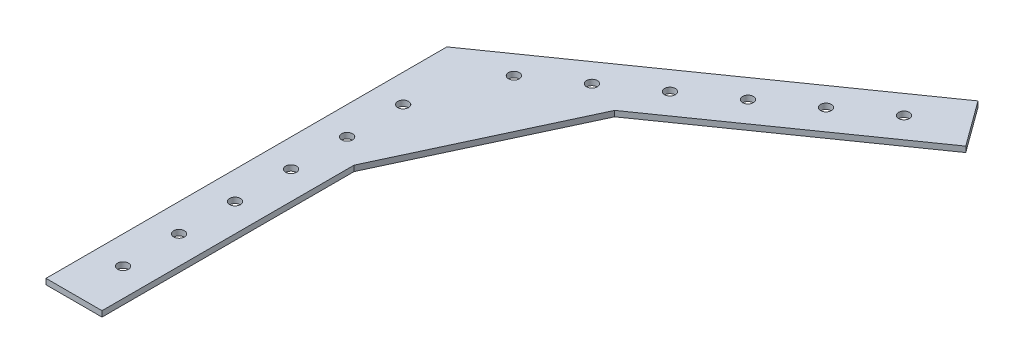
ISO-10303-21;
HEADER;
FILE_DESCRIPTION(('STEP AP214'),'2;1');
FILE_NAME('part.step','',(''),(''),'','','');
FILE_SCHEMA(('AUTOMOTIVE_DESIGN { 1 0 10303 214 1 1 1 1 }'));
ENDSEC;
DATA;
#1=APPLICATION_CONTEXT('core data for automotive mechanical design processes');
#2=APPLICATION_PROTOCOL_DEFINITION('international standard','automotive_design',2000,#1);
#3=PRODUCT_CONTEXT('',#1,'mechanical');
#4=PRODUCT('Part','Part','',(#3));
#5=PRODUCT_RELATED_PRODUCT_CATEGORY('part','',(#4));
#6=PRODUCT_DEFINITION_FORMATION('','',#4);
#7=PRODUCT_DEFINITION_CONTEXT('part definition',#1,'design');
#8=PRODUCT_DEFINITION('design','',#6,#7);
#9=PRODUCT_DEFINITION_SHAPE('','',#8);
#10=(LENGTH_UNIT() NAMED_UNIT(*) SI_UNIT(.MILLI.,.METRE.));
#11=(NAMED_UNIT(*) PLANE_ANGLE_UNIT() SI_UNIT($,.RADIAN.));
#12=(NAMED_UNIT(*) SI_UNIT($,.STERADIAN.) SOLID_ANGLE_UNIT());
#13=UNCERTAINTY_MEASURE_WITH_UNIT(LENGTH_MEASURE(1.E-05),#10,'distance_accuracy_value','');
#14=(GEOMETRIC_REPRESENTATION_CONTEXT(3) GLOBAL_UNCERTAINTY_ASSIGNED_CONTEXT((#13)) GLOBAL_UNIT_ASSIGNED_CONTEXT((#10,
#11,#12)) REPRESENTATION_CONTEXT('',''));
#15=CARTESIAN_POINT('',(0.,0.,0.));
#16=DIRECTION('',(0.,0.,1.));
#17=DIRECTION('',(1.,0.,0.));
#18=AXIS2_PLACEMENT_3D('',#15,#16,#17);
#19=CARTESIAN_POINT('',(-23.7324746001748,1.27,114.072394731341));
#20=DIRECTION('',(-1.,0.,0.));
#21=DIRECTION('',(0.,0.,1.));
#22=AXIS2_PLACEMENT_3D('',#19,#20,#21);
#23=PLANE('',#22);
#24=DIRECTION('',(0.,0.,-1.));
#25=VECTOR('',#24,1.);
#26=CARTESIAN_POINT('',(-23.7324746001748,-1.27,114.072394731341));
#27=LINE('',#26,#25);
#28=CARTESIAN_POINT('',(-23.7324746001748,-1.27,114.072394731341));
#29=VERTEX_POINT('',#28);
#30=CARTESIAN_POINT('',(-23.7324746001748,-1.27,-0.227605268659253));
#31=VERTEX_POINT('',#30);
#32=EDGE_CURVE('E122',#29,#31,#27,.T.);
#33=ORIENTED_EDGE('',*,*,#32,.T.);
#34=DIRECTION('',(0.,-1.,0.));
#35=VECTOR('',#34,1.);
#36=CARTESIAN_POINT('',(-23.7324746001748,1.27,-0.227605268659253));
#37=LINE('',#36,#35);
#38=CARTESIAN_POINT('',(-23.7324746001748,1.27,-0.227605268659253));
#39=VERTEX_POINT('',#38);
#40=EDGE_CURVE('E11',#39,#31,#37,.T.);
#41=ORIENTED_EDGE('',*,*,#40,.F.);
#42=DIRECTION('',(0.,0.,-1.));
#43=VECTOR('',#42,1.);
#44=CARTESIAN_POINT('',(-23.7324746001748,1.27,114.072394731341));
#45=LINE('',#44,#43);
#46=CARTESIAN_POINT('',(-23.7324746001748,1.27,114.072394731341));
#47=VERTEX_POINT('',#46);
#48=EDGE_CURVE('E138',#47,#39,#45,.T.);
#49=ORIENTED_EDGE('',*,*,#48,.F.);
#50=DIRECTION('',(0.,-1.,0.));
#51=VECTOR('',#50,1.);
#52=CARTESIAN_POINT('',(-23.7324746001748,1.27,114.072394731341));
#53=LINE('',#52,#51);
#54=EDGE_CURVE('E118',#47,#29,#53,.T.);
#55=ORIENTED_EDGE('',*,*,#54,.T.);
#56=EDGE_LOOP('',(#33,#41,#49,#55));
#57=FACE_BOUND('',#56,.T.);
#58=ADVANCED_FACE('F32',(#57),#23,.F.);
#59=CARTESIAN_POINT('',(-23.7324746001748,1.27,-0.227605268659253));
#60=DIRECTION('',(-0.90630778703665,0.,-0.4226182617407));
#61=DIRECTION('',(-0.4226182617407,0.,0.90630778703665));
#62=AXIS2_PLACEMENT_3D('',#59,#60,#61);
#63=PLANE('',#62);
#64=DIRECTION('',(0.4226182617407,0.,-0.90630778703665));
#65=VECTOR('',#64,1.);
#66=CARTESIAN_POINT('',(-23.7324746001748,-1.27,-0.227605268659253));
#67=LINE('',#66,#65);
#68=CARTESIAN_POINT('',(13.8382888685734,-1.27,-80.7983675362174));
#69=VERTEX_POINT('',#68);
#70=EDGE_CURVE('E125',#31,#69,#67,.T.);
#71=ORIENTED_EDGE('',*,*,#70,.T.);
#72=DIRECTION('',(0.,-1.,0.));
#73=VECTOR('',#72,1.);
#74=CARTESIAN_POINT('',(13.8382888685734,1.27,-80.7983675362174));
#75=LINE('',#74,#73);
#76=CARTESIAN_POINT('',(13.8382888685734,1.27,-80.7983675362174));
#77=VERTEX_POINT('',#76);
#78=EDGE_CURVE('E41',#77,#69,#75,.T.);
#79=ORIENTED_EDGE('',*,*,#78,.F.);
#80=DIRECTION('',(0.4226182617407,0.,-0.90630778703665));
#81=VECTOR('',#80,1.);
#82=CARTESIAN_POINT('',(-23.7324746001748,1.27,-0.227605268659253));
#83=LINE('',#82,#81);
#84=EDGE_CURVE('E86',#39,#77,#83,.T.);
#85=ORIENTED_EDGE('',*,*,#84,.F.);
#86=ORIENTED_EDGE('',*,*,#40,.T.);
#87=EDGE_LOOP('',(#71,#79,#85,#86));
#88=FACE_BOUND('',#87,.T.);
#89=ADVANCED_FACE('F239',(#88),#63,.F.);
#90=CARTESIAN_POINT('',(13.8382888685734,1.27,-80.7983675362174));
#91=DIRECTION('',(-0.573576436351044,0.,-0.819152044288993));
#92=DIRECTION('',(-0.819152044288993,0.,0.573576436351044));
#93=AXIS2_PLACEMENT_3D('',#90,#91,#92);
#94=PLANE('',#93);
#95=DIRECTION('',(0.819152044288993,0.,-0.573576436351044));
#96=VECTOR('',#95,1.);
#97=CARTESIAN_POINT('',(13.8382888685734,-1.27,-80.7983675362174));
#98=LINE('',#97,#96);
#99=CARTESIAN_POINT('',(107.467367530805,-1.27,-146.358154211142));
#100=VERTEX_POINT('',#99);
#101=EDGE_CURVE('E128',#69,#100,#98,.T.);
#102=ORIENTED_EDGE('',*,*,#101,.T.);
#103=DIRECTION('',(0.,-1.,0.));
#104=VECTOR('',#103,1.);
#105=CARTESIAN_POINT('',(107.467367530805,1.27,-146.358154211142));
#106=LINE('',#105,#104);
#107=CARTESIAN_POINT('',(107.467367530805,1.27,-146.358154211142));
#108=VERTEX_POINT('',#107);
#109=EDGE_CURVE('E142',#108,#100,#106,.T.);
#110=ORIENTED_EDGE('',*,*,#109,.F.);
#111=DIRECTION('',(0.819152044288993,0.,-0.573576436351044));
#112=VECTOR('',#111,1.);
#113=CARTESIAN_POINT('',(13.8382888685734,1.27,-80.7983675362174));
#114=LINE('',#113,#112);
#115=EDGE_CURVE('E215',#77,#108,#114,.T.);
#116=ORIENTED_EDGE('',*,*,#115,.F.);
#117=ORIENTED_EDGE('',*,*,#78,.T.);
#118=EDGE_LOOP('',(#102,#110,#116,#117));
#119=FACE_BOUND('',#118,.T.);
#120=ADVANCED_FACE('F243',(#119),#94,.F.);
#121=CARTESIAN_POINT('',(92.497603038843,1.27,-166.878050679087));
#122=DIRECTION('',(0.807869939682874,0.,-0.589360806770173));
#123=DIRECTION('',(-0.589360806770173,0.,-0.807869939682874));
#124=AXIS2_PLACEMENT_3D('',#121,#122,#123);
#125=PLANE('',#124);
#126=DIRECTION('',(0.589360806770173,0.,0.807869939682874));
#127=VECTOR('',#126,1.);
#128=CARTESIAN_POINT('',(92.497603038843,-1.27,-166.878050679087));
#129=LINE('',#128,#127);
#130=CARTESIAN_POINT('',(92.497603038843,-1.27,-166.878050679087));
#131=VERTEX_POINT('',#130);
#132=EDGE_CURVE('E131',#131,#100,#129,.T.);
#133=ORIENTED_EDGE('',*,*,#132,.F.);
#134=DIRECTION('',(0.,-1.,0.));
#135=VECTOR('',#134,1.);
#136=CARTESIAN_POINT('',(92.497603038843,1.27,-166.878050679087));
#137=LINE('',#136,#135);
#138=CARTESIAN_POINT('',(92.497603038843,1.27,-166.878050679087));
#139=VERTEX_POINT('',#138);
#140=EDGE_CURVE('E108',#139,#131,#137,.T.);
#141=ORIENTED_EDGE('',*,*,#140,.F.);
#142=DIRECTION('',(0.589360806770173,0.,0.807869939682874));
#143=VECTOR('',#142,1.);
#144=CARTESIAN_POINT('',(92.497603038843,1.27,-166.878050679087));
#145=LINE('',#144,#143);
#146=EDGE_CURVE('E114',#139,#108,#145,.T.);
#147=ORIENTED_EDGE('',*,*,#146,.T.);
#148=ORIENTED_EDGE('',*,*,#109,.T.);
#149=EDGE_LOOP('',(#133,#141,#147,#148));
#150=FACE_BOUND('',#149,.T.);
#151=ADVANCED_FACE('F218',(#150),#125,.T.);
#152=CARTESIAN_POINT('',(-49.1324746001748,1.27,-67.7076026790206));
#153=DIRECTION('',(-0.573576436351044,0.,-0.819152044288993));
#154=DIRECTION('',(-0.819152044288993,0.,0.573576436351044));
#155=AXIS2_PLACEMENT_3D('',#152,#153,#154);
#156=PLANE('',#155);
#157=DIRECTION('',(0.819152044288993,0.,-0.573576436351044));
#158=VECTOR('',#157,1.);
#159=CARTESIAN_POINT('',(-49.1324746001748,-1.27,-67.7076026790206));
#160=LINE('',#159,#158);
#161=CARTESIAN_POINT('',(-49.1324746001748,-1.27,-67.7076026790206));
#162=VERTEX_POINT('',#161);
#163=EDGE_CURVE('E103',#162,#131,#160,.T.);
#164=ORIENTED_EDGE('',*,*,#163,.F.);
#165=DIRECTION('',(0.,-1.,0.));
#166=VECTOR('',#165,1.);
#167=CARTESIAN_POINT('',(-49.1324746001748,1.27,-67.7076026790206));
#168=LINE('',#167,#166);
#169=CARTESIAN_POINT('',(-49.1324746001748,1.27,-67.7076026790206));
#170=VERTEX_POINT('',#169);
#171=EDGE_CURVE('E98',#170,#162,#168,.T.);
#172=ORIENTED_EDGE('',*,*,#171,.F.);
#173=DIRECTION('',(0.819152044288993,0.,-0.573576436351044));
#174=VECTOR('',#173,1.);
#175=CARTESIAN_POINT('',(-49.1324746001748,1.27,-67.7076026790206));
#176=LINE('',#175,#174);
#177=EDGE_CURVE('E101',#170,#139,#176,.T.);
#178=ORIENTED_EDGE('',*,*,#177,.T.);
#179=ORIENTED_EDGE('',*,*,#140,.T.);
#180=EDGE_LOOP('',(#164,#172,#178,#179));
#181=FACE_BOUND('',#180,.T.);
#182=ADVANCED_FACE('F100',(#181),#156,.T.);
#183=CARTESIAN_POINT('',(-49.1324746001748,1.27,114.072394731341));
#184=DIRECTION('',(-1.,0.,0.));
#185=DIRECTION('',(0.,0.,1.));
#186=AXIS2_PLACEMENT_3D('',#183,#184,#185);
#187=PLANE('',#186);
#188=DIRECTION('',(0.,0.,-1.));
#189=VECTOR('',#188,1.);
#190=CARTESIAN_POINT('',(-49.1324746001748,-1.27,114.072394731341));
#191=LINE('',#190,#189);
#192=CARTESIAN_POINT('',(-49.1324746001748,-1.27,114.072394731341));
#193=VERTEX_POINT('',#192);
#194=EDGE_CURVE('E135',#193,#162,#191,.T.);
#195=ORIENTED_EDGE('',*,*,#194,.F.);
#196=DIRECTION('',(0.,-1.,0.));
#197=VECTOR('',#196,1.);
#198=CARTESIAN_POINT('',(-49.1324746001748,1.27,114.072394731341));
#199=LINE('',#198,#197);
#200=CARTESIAN_POINT('',(-49.1324746001748,1.27,114.072394731341));
#201=VERTEX_POINT('',#200);
#202=EDGE_CURVE('E75',#201,#193,#199,.T.);
#203=ORIENTED_EDGE('',*,*,#202,.F.);
#204=DIRECTION('',(0.,0.,-1.));
#205=VECTOR('',#204,1.);
#206=CARTESIAN_POINT('',(-49.1324746001748,1.27,114.072394731341));
#207=LINE('',#206,#205);
#208=EDGE_CURVE('E112',#201,#170,#207,.T.);
#209=ORIENTED_EDGE('',*,*,#208,.T.);
#210=ORIENTED_EDGE('',*,*,#171,.T.);
#211=EDGE_LOOP('',(#195,#203,#209,#210));
#212=FACE_BOUND('',#211,.T.);
#213=ADVANCED_FACE('F116',(#212),#187,.T.);
#214=CARTESIAN_POINT('',(-49.1324746001748,1.27,114.072394731341));
#215=DIRECTION('',(0.,0.,-1.));
#216=DIRECTION('',(-1.,0.,0.));
#217=AXIS2_PLACEMENT_3D('',#214,#215,#216);
#218=PLANE('',#217);
#219=DIRECTION('',(1.,0.,0.));
#220=VECTOR('',#219,1.);
#221=CARTESIAN_POINT('',(-49.1324746001748,-1.27,114.072394731341));
#222=LINE('',#221,#220);
#223=EDGE_CURVE('E78',#193,#29,#222,.T.);
#224=ORIENTED_EDGE('',*,*,#223,.T.);
#225=ORIENTED_EDGE('',*,*,#54,.F.);
#226=DIRECTION('',(1.,0.,0.));
#227=VECTOR('',#226,1.);
#228=CARTESIAN_POINT('',(-49.1324746001748,1.27,114.072394731341));
#229=LINE('',#228,#227);
#230=EDGE_CURVE('E50',#201,#47,#229,.T.);
#231=ORIENTED_EDGE('',*,*,#230,.F.);
#232=ORIENTED_EDGE('',*,*,#202,.T.);
#233=EDGE_LOOP('',(#224,#225,#231,#232));
#234=FACE_BOUND('',#233,.T.);
#235=ADVANCED_FACE('F227',(#234),#218,.F.);
#236=CARTESIAN_POINT('',(0.,1.27,0.));
#237=DIRECTION('',(0.,-1.,0.));
#238=DIRECTION('',(0.,0.,-1.));
#239=AXIS2_PLACEMENT_3D('',#236,#237,#238);
#240=PLANE('',#239);
#241=CARTESIAN_POINT('',(81.4135878139662,1.27,-144.40554039955));
#242=DIRECTION('',(0.,1.,0.));
#243=DIRECTION('',(0.,0.,1.));
#244=AXIS2_PLACEMENT_3D('',#241,#242,#243);
#245=CIRCLE('',#244,2.45744999999999);
#246=CARTESIAN_POINT('',(81.4135878139662,1.27,-141.94809039955));
#247=VERTEX_POINT('',#246);
#248=EDGE_CURVE('E407',#247,#247,#245,.T.);
#249=ORIENTED_EDGE('',*,*,#248,.F.);
#250=EDGE_LOOP('',(#249));
#251=FACE_BOUND('',#250,.T.);
#252=CARTESIAN_POINT('',(60.6071258890258,1.27,-129.836698916233));
#253=DIRECTION('',(0.,1.,0.));
#254=DIRECTION('',(0.,0.,1.));
#255=AXIS2_PLACEMENT_3D('',#252,#253,#254);
#256=CIRCLE('',#255,2.45744999999999);
#257=CARTESIAN_POINT('',(60.6071258890258,1.27,-127.379248916233));
#258=VERTEX_POINT('',#257);
#259=EDGE_CURVE('E186',#258,#258,#256,.T.);
#260=ORIENTED_EDGE('',*,*,#259,.F.);
#261=EDGE_LOOP('',(#260));
#262=FACE_BOUND('',#261,.T.);
#263=CARTESIAN_POINT('',(39.8006639640853,1.27,-115.267857432917));
#264=DIRECTION('',(0.,1.,0.));
#265=DIRECTION('',(0.,0.,1.));
#266=AXIS2_PLACEMENT_3D('',#263,#264,#265);
#267=CIRCLE('',#266,2.45744999999999);
#268=CARTESIAN_POINT('',(39.8006639640853,1.27,-112.810407432917));
#269=VERTEX_POINT('',#268);
#270=EDGE_CURVE('E174',#269,#269,#267,.T.);
#271=ORIENTED_EDGE('',*,*,#270,.F.);
#272=EDGE_LOOP('',(#271));
#273=FACE_BOUND('',#272,.T.);
#274=CARTESIAN_POINT('',(18.9942020391449,1.27,-100.6990159496));
#275=DIRECTION('',(0.,1.,0.));
#276=DIRECTION('',(0.,0.,1.));
#277=AXIS2_PLACEMENT_3D('',#274,#275,#276);
#278=CIRCLE('',#277,2.45744999999999);
#279=CARTESIAN_POINT('',(18.9942020391449,1.27,-98.2415659496001));
#280=VERTEX_POINT('',#279);
#281=EDGE_CURVE('E173',#280,#280,#278,.T.);
#282=ORIENTED_EDGE('',*,*,#281,.F.);
#283=EDGE_LOOP('',(#282));
#284=FACE_BOUND('',#283,.T.);
#285=CARTESIAN_POINT('',(-1.81225988579552,1.27,-86.1301744662836));
#286=DIRECTION('',(0.,1.,0.));
#287=DIRECTION('',(0.,0.,1.));
#288=AXIS2_PLACEMENT_3D('',#285,#286,#287);
#289=CIRCLE('',#288,2.45744999999999);
#290=CARTESIAN_POINT('',(-1.81225988579552,1.27,-83.6727244662836));
#291=VERTEX_POINT('',#290);
#292=EDGE_CURVE('E170',#291,#291,#289,.T.);
#293=ORIENTED_EDGE('',*,*,#292,.F.);
#294=EDGE_LOOP('',(#293));
#295=FACE_BOUND('',#294,.T.);
#296=CARTESIAN_POINT('',(-22.6187218107359,1.27,-71.5613329829671));
#297=DIRECTION('',(0.,1.,0.));
#298=DIRECTION('',(0.,0.,1.));
#299=AXIS2_PLACEMENT_3D('',#296,#297,#298);
#300=CIRCLE('',#299,2.45744999999999);
#301=CARTESIAN_POINT('',(-22.6187218107359,1.27,-69.1038829829671));
#302=VERTEX_POINT('',#301);
#303=EDGE_CURVE('E167',#302,#302,#300,.T.);
#304=ORIENTED_EDGE('',*,*,#303,.F.);
#305=EDGE_LOOP('',(#304));
#306=FACE_BOUND('',#305,.T.);
#307=CARTESIAN_POINT('',(-36.4324746001748,1.27,-35.1526052686593));
#308=DIRECTION('',(0.,1.,0.));
#309=DIRECTION('',(0.,0.,1.));
#310=AXIS2_PLACEMENT_3D('',#307,#308,#309);
#311=CIRCLE('',#310,2.45744999999999);
#312=CARTESIAN_POINT('',(-36.4324746001748,1.27,-32.6951552686593));
#313=VERTEX_POINT('',#312);
#314=EDGE_CURVE('E163',#313,#313,#311,.T.);
#315=ORIENTED_EDGE('',*,*,#314,.F.);
#316=EDGE_LOOP('',(#315));
#317=FACE_BOUND('',#316,.T.);
#318=CARTESIAN_POINT('',(-36.4324746001748,1.27,-9.75260526865925));
#319=DIRECTION('',(0.,1.,0.));
#320=DIRECTION('',(0.,0.,1.));
#321=AXIS2_PLACEMENT_3D('',#318,#319,#320);
#322=CIRCLE('',#321,2.45744999999999);
#323=CARTESIAN_POINT('',(-36.4324746001748,1.27,-7.29515526865926));
#324=VERTEX_POINT('',#323);
#325=EDGE_CURVE('E159',#324,#324,#322,.T.);
#326=ORIENTED_EDGE('',*,*,#325,.F.);
#327=EDGE_LOOP('',(#326));
#328=FACE_BOUND('',#327,.T.);
#329=CARTESIAN_POINT('',(-36.4324746001748,1.27,15.6473947313408));
#330=DIRECTION('',(0.,1.,0.));
#331=DIRECTION('',(0.,0.,1.));
#332=AXIS2_PLACEMENT_3D('',#329,#330,#331);
#333=CIRCLE('',#332,2.45744999999999);
#334=CARTESIAN_POINT('',(-36.4324746001748,1.27,18.1048447313407));
#335=VERTEX_POINT('',#334);
#336=EDGE_CURVE('E155',#335,#335,#333,.T.);
#337=ORIENTED_EDGE('',*,*,#336,.F.);
#338=EDGE_LOOP('',(#337));
#339=FACE_BOUND('',#338,.T.);
#340=CARTESIAN_POINT('',(-36.4324746001748,1.27,41.0473947313408));
#341=DIRECTION('',(0.,1.,0.));
#342=DIRECTION('',(0.,0.,1.));
#343=AXIS2_PLACEMENT_3D('',#340,#341,#342);
#344=CIRCLE('',#343,2.45744999999999);
#345=CARTESIAN_POINT('',(-36.4324746001748,1.27,43.5048447313407));
#346=VERTEX_POINT('',#345);
#347=EDGE_CURVE('E154',#346,#346,#344,.T.);
#348=ORIENTED_EDGE('',*,*,#347,.F.);
#349=EDGE_LOOP('',(#348));
#350=FACE_BOUND('',#349,.T.);
#351=CARTESIAN_POINT('',(-36.4324746001748,1.27,66.4473947313408));
#352=DIRECTION('',(0.,1.,0.));
#353=DIRECTION('',(0.,0.,1.));
#354=AXIS2_PLACEMENT_3D('',#351,#352,#353);
#355=CIRCLE('',#354,2.45744999999999);
#356=CARTESIAN_POINT('',(-36.4324746001748,1.27,68.9048447313407));
#357=VERTEX_POINT('',#356);
#358=EDGE_CURVE('E150',#357,#357,#355,.T.);
#359=ORIENTED_EDGE('',*,*,#358,.F.);
#360=EDGE_LOOP('',(#359));
#361=FACE_BOUND('',#360,.T.);
#362=CARTESIAN_POINT('',(-36.4324746001748,1.27,91.8473947313408));
#363=DIRECTION('',(0.,1.,0.));
#364=DIRECTION('',(0.,0.,1.));
#365=AXIS2_PLACEMENT_3D('',#362,#363,#364);
#366=CIRCLE('',#365,2.45744999999999);
#367=CARTESIAN_POINT('',(-36.4324746001748,1.27,94.3048447313407));
#368=VERTEX_POINT('',#367);
#369=EDGE_CURVE('E149',#368,#368,#366,.T.);
#370=ORIENTED_EDGE('',*,*,#369,.F.);
#371=EDGE_LOOP('',(#370));
#372=FACE_BOUND('',#371,.T.);
#373=ORIENTED_EDGE('',*,*,#48,.T.);
#374=ORIENTED_EDGE('',*,*,#84,.T.);
#375=ORIENTED_EDGE('',*,*,#115,.T.);
#376=ORIENTED_EDGE('',*,*,#146,.F.);
#377=ORIENTED_EDGE('',*,*,#177,.F.);
#378=ORIENTED_EDGE('',*,*,#208,.F.);
#379=ORIENTED_EDGE('',*,*,#230,.T.);
#380=EDGE_LOOP('',(#373,#374,#375,#376,#377,#378,#379));
#381=FACE_BOUND('',#380,.T.);
#382=ADVANCED_FACE('F111',(#251,#262,#273,#284,#295,#306,#317,#328,#339,#350,#361,#372,#381),
#240,.F.);
#383=CARTESIAN_POINT('',(0.,-1.27,0.));
#384=DIRECTION('',(0.,-1.,0.));
#385=DIRECTION('',(0.,0.,-1.));
#386=AXIS2_PLACEMENT_3D('',#383,#384,#385);
#387=PLANE('',#386);
#388=CARTESIAN_POINT('',(81.4135878139662,-1.27,-144.40554039955));
#389=DIRECTION('',(0.,-1.,0.));
#390=DIRECTION('',(0.,0.,-1.));
#391=AXIS2_PLACEMENT_3D('',#388,#389,#390);
#392=CIRCLE('',#391,2.45744999999999);
#393=CARTESIAN_POINT('',(81.4135878139662,-1.27,-146.86299039955));
#394=VERTEX_POINT('',#393);
#395=EDGE_CURVE('E35',#394,#394,#392,.T.);
#396=ORIENTED_EDGE('',*,*,#395,.F.);
#397=EDGE_LOOP('',(#396));
#398=FACE_BOUND('',#397,.T.);
#399=CARTESIAN_POINT('',(60.6071258890258,-1.27,-129.836698916233));
#400=DIRECTION('',(0.,-1.,0.));
#401=DIRECTION('',(0.,0.,-1.));
#402=AXIS2_PLACEMENT_3D('',#399,#400,#401);
#403=CIRCLE('',#402,2.45744999999999);
#404=CARTESIAN_POINT('',(60.6071258890258,-1.27,-132.294148916233));
#405=VERTEX_POINT('',#404);
#406=EDGE_CURVE('E181',#405,#405,#403,.T.);
#407=ORIENTED_EDGE('',*,*,#406,.F.);
#408=EDGE_LOOP('',(#407));
#409=FACE_BOUND('',#408,.T.);
#410=CARTESIAN_POINT('',(39.8006639640853,-1.27,-115.267857432917));
#411=DIRECTION('',(0.,-1.,0.));
#412=DIRECTION('',(0.,0.,-1.));
#413=AXIS2_PLACEMENT_3D('',#410,#411,#412);
#414=CIRCLE('',#413,2.45744999999999);
#415=CARTESIAN_POINT('',(39.8006639640853,-1.27,-117.725307432917));
#416=VERTEX_POINT('',#415);
#417=EDGE_CURVE('E171',#416,#416,#414,.T.);
#418=ORIENTED_EDGE('',*,*,#417,.F.);
#419=EDGE_LOOP('',(#418));
#420=FACE_BOUND('',#419,.T.);
#421=CARTESIAN_POINT('',(18.9942020391449,-1.27,-100.6990159496));
#422=DIRECTION('',(0.,-1.,0.));
#423=DIRECTION('',(0.,0.,-1.));
#424=AXIS2_PLACEMENT_3D('',#421,#422,#423);
#425=CIRCLE('',#424,2.45744999999999);
#426=CARTESIAN_POINT('',(18.9942020391449,-1.27,-103.1564659496));
#427=VERTEX_POINT('',#426);
#428=EDGE_CURVE('E178',#427,#427,#425,.T.);
#429=ORIENTED_EDGE('',*,*,#428,.F.);
#430=EDGE_LOOP('',(#429));
#431=FACE_BOUND('',#430,.T.);
#432=CARTESIAN_POINT('',(-1.81225988579552,-1.27,-86.1301744662836));
#433=DIRECTION('',(0.,-1.,0.));
#434=DIRECTION('',(0.,0.,-1.));
#435=AXIS2_PLACEMENT_3D('',#432,#433,#434);
#436=CIRCLE('',#435,2.45744999999999);
#437=CARTESIAN_POINT('',(-1.81225988579552,-1.27,-88.5876244662836));
#438=VERTEX_POINT('',#437);
#439=EDGE_CURVE('E168',#438,#438,#436,.T.);
#440=ORIENTED_EDGE('',*,*,#439,.F.);
#441=EDGE_LOOP('',(#440));
#442=FACE_BOUND('',#441,.T.);
#443=CARTESIAN_POINT('',(-22.6187218107359,-1.27,-71.5613329829671));
#444=DIRECTION('',(0.,-1.,0.));
#445=DIRECTION('',(0.,0.,-1.));
#446=AXIS2_PLACEMENT_3D('',#443,#444,#445);
#447=CIRCLE('',#446,2.45744999999999);
#448=CARTESIAN_POINT('',(-22.6187218107359,-1.27,-74.0187829829671));
#449=VERTEX_POINT('',#448);
#450=EDGE_CURVE('E164',#449,#449,#447,.T.);
#451=ORIENTED_EDGE('',*,*,#450,.F.);
#452=EDGE_LOOP('',(#451));
#453=FACE_BOUND('',#452,.T.);
#454=CARTESIAN_POINT('',(-36.4324746001748,-1.27,-35.1526052686593));
#455=DIRECTION('',(0.,-1.,0.));
#456=DIRECTION('',(0.,0.,-1.));
#457=AXIS2_PLACEMENT_3D('',#454,#455,#456);
#458=CIRCLE('',#457,2.45744999999999);
#459=CARTESIAN_POINT('',(-36.4324746001748,-1.27,-37.6100552686592));
#460=VERTEX_POINT('',#459);
#461=EDGE_CURVE('E160',#460,#460,#458,.T.);
#462=ORIENTED_EDGE('',*,*,#461,.F.);
#463=EDGE_LOOP('',(#462));
#464=FACE_BOUND('',#463,.T.);
#465=CARTESIAN_POINT('',(-36.4324746001748,-1.27,-9.75260526865925));
#466=DIRECTION('',(0.,-1.,0.));
#467=DIRECTION('',(0.,0.,-1.));
#468=AXIS2_PLACEMENT_3D('',#465,#466,#467);
#469=CIRCLE('',#468,2.45744999999999);
#470=CARTESIAN_POINT('',(-36.4324746001748,-1.27,-12.2100552686592));
#471=VERTEX_POINT('',#470);
#472=EDGE_CURVE('E156',#471,#471,#469,.T.);
#473=ORIENTED_EDGE('',*,*,#472,.F.);
#474=EDGE_LOOP('',(#473));
#475=FACE_BOUND('',#474,.T.);
#476=CARTESIAN_POINT('',(-36.4324746001748,-1.27,15.6473947313408));
#477=DIRECTION('',(0.,-1.,0.));
#478=DIRECTION('',(0.,0.,-1.));
#479=AXIS2_PLACEMENT_3D('',#476,#477,#478);
#480=CIRCLE('',#479,2.45744999999999);
#481=CARTESIAN_POINT('',(-36.4324746001748,-1.27,13.1899447313408));
#482=VERTEX_POINT('',#481);
#483=EDGE_CURVE('E151',#482,#482,#480,.T.);
#484=ORIENTED_EDGE('',*,*,#483,.F.);
#485=EDGE_LOOP('',(#484));
#486=FACE_BOUND('',#485,.T.);
#487=CARTESIAN_POINT('',(-36.4324746001748,-1.27,41.0473947313408));
#488=DIRECTION('',(0.,-1.,0.));
#489=DIRECTION('',(0.,0.,-1.));
#490=AXIS2_PLACEMENT_3D('',#487,#488,#489);
#491=CIRCLE('',#490,2.45744999999999);
#492=CARTESIAN_POINT('',(-36.4324746001748,-1.27,38.5899447313408));
#493=VERTEX_POINT('',#492);
#494=EDGE_CURVE('E204',#493,#493,#491,.T.);
#495=ORIENTED_EDGE('',*,*,#494,.F.);
#496=EDGE_LOOP('',(#495));
#497=FACE_BOUND('',#496,.T.);
#498=CARTESIAN_POINT('',(-36.4324746001748,-1.27,66.4473947313408));
#499=DIRECTION('',(0.,-1.,0.));
#500=DIRECTION('',(0.,0.,-1.));
#501=AXIS2_PLACEMENT_3D('',#498,#499,#500);
#502=CIRCLE('',#501,2.45744999999999);
#503=CARTESIAN_POINT('',(-36.4324746001748,-1.27,63.9899447313408));
#504=VERTEX_POINT('',#503);
#505=EDGE_CURVE('E146',#504,#504,#502,.T.);
#506=ORIENTED_EDGE('',*,*,#505,.F.);
#507=EDGE_LOOP('',(#506));
#508=FACE_BOUND('',#507,.T.);
#509=CARTESIAN_POINT('',(-36.4324746001748,-1.27,91.8473947313408));
#510=DIRECTION('',(0.,-1.,0.));
#511=DIRECTION('',(0.,0.,-1.));
#512=AXIS2_PLACEMENT_3D('',#509,#510,#511);
#513=CIRCLE('',#512,2.45744999999999);
#514=CARTESIAN_POINT('',(-36.4324746001748,-1.27,89.3899447313408));
#515=VERTEX_POINT('',#514);
#516=EDGE_CURVE('E126',#515,#515,#513,.T.);
#517=ORIENTED_EDGE('',*,*,#516,.F.);
#518=EDGE_LOOP('',(#517));
#519=FACE_BOUND('',#518,.T.);
#520=ORIENTED_EDGE('',*,*,#32,.F.);
#521=ORIENTED_EDGE('',*,*,#223,.F.);
#522=ORIENTED_EDGE('',*,*,#194,.T.);
#523=ORIENTED_EDGE('',*,*,#163,.T.);
#524=ORIENTED_EDGE('',*,*,#132,.T.);
#525=ORIENTED_EDGE('',*,*,#101,.F.);
#526=ORIENTED_EDGE('',*,*,#70,.F.);
#527=EDGE_LOOP('',(#520,#521,#522,#523,#524,#525,#526));
#528=FACE_BOUND('',#527,.T.);
#529=ADVANCED_FACE('F223',(#398,#409,#420,#431,#442,#453,#464,#475,#486,#497,#508,#519,#528),
#387,.T.);
#530=CARTESIAN_POINT('',(-36.4324746001748,1.27,91.8473947313408));
#531=DIRECTION('',(0.,1.,0.));
#532=DIRECTION('',(0.,0.,1.));
#533=AXIS2_PLACEMENT_3D('',#530,#531,#532);
#534=CYLINDRICAL_SURFACE('',#533,2.45744999999999);
#535=ORIENTED_EDGE('',*,*,#516,.T.);
#536=EDGE_LOOP('',(#535));
#537=FACE_BOUND('',#536,.T.);
#538=ORIENTED_EDGE('',*,*,#369,.T.);
#539=EDGE_LOOP('',(#538));
#540=FACE_BOUND('',#539,.T.);
#541=ADVANCED_FACE('F280',(#537,#540),#534,.F.);
#542=CARTESIAN_POINT('',(-36.4324746001748,1.27,66.4473947313408));
#543=DIRECTION('',(0.,1.,0.));
#544=DIRECTION('',(0.,0.,1.));
#545=AXIS2_PLACEMENT_3D('',#542,#543,#544);
#546=CYLINDRICAL_SURFACE('',#545,2.45744999999999);
#547=ORIENTED_EDGE('',*,*,#505,.T.);
#548=EDGE_LOOP('',(#547));
#549=FACE_BOUND('',#548,.T.);
#550=ORIENTED_EDGE('',*,*,#358,.T.);
#551=EDGE_LOOP('',(#550));
#552=FACE_BOUND('',#551,.T.);
#553=ADVANCED_FACE('F289',(#549,#552),#546,.F.);
#554=CARTESIAN_POINT('',(-36.4324746001748,1.27,41.0473947313408));
#555=DIRECTION('',(0.,1.,0.));
#556=DIRECTION('',(0.,0.,1.));
#557=AXIS2_PLACEMENT_3D('',#554,#555,#556);
#558=CYLINDRICAL_SURFACE('',#557,2.45744999999999);
#559=ORIENTED_EDGE('',*,*,#494,.T.);
#560=EDGE_LOOP('',(#559));
#561=FACE_BOUND('',#560,.T.);
#562=ORIENTED_EDGE('',*,*,#347,.T.);
#563=EDGE_LOOP('',(#562));
#564=FACE_BOUND('',#563,.T.);
#565=ADVANCED_FACE('F299',(#561,#564),#558,.F.);
#566=CARTESIAN_POINT('',(-36.4324746001748,1.27,15.6473947313408));
#567=DIRECTION('',(0.,1.,0.));
#568=DIRECTION('',(0.,0.,1.));
#569=AXIS2_PLACEMENT_3D('',#566,#567,#568);
#570=CYLINDRICAL_SURFACE('',#569,2.45744999999999);
#571=ORIENTED_EDGE('',*,*,#483,.T.);
#572=EDGE_LOOP('',(#571));
#573=FACE_BOUND('',#572,.T.);
#574=ORIENTED_EDGE('',*,*,#336,.T.);
#575=EDGE_LOOP('',(#574));
#576=FACE_BOUND('',#575,.T.);
#577=ADVANCED_FACE('F309',(#573,#576),#570,.F.);
#578=CARTESIAN_POINT('',(-36.4324746001748,1.27,-9.75260526865925));
#579=DIRECTION('',(0.,1.,0.));
#580=DIRECTION('',(0.,0.,1.));
#581=AXIS2_PLACEMENT_3D('',#578,#579,#580);
#582=CYLINDRICAL_SURFACE('',#581,2.45744999999999);
#583=ORIENTED_EDGE('',*,*,#472,.T.);
#584=EDGE_LOOP('',(#583));
#585=FACE_BOUND('',#584,.T.);
#586=ORIENTED_EDGE('',*,*,#325,.T.);
#587=EDGE_LOOP('',(#586));
#588=FACE_BOUND('',#587,.T.);
#589=ADVANCED_FACE('F319',(#585,#588),#582,.F.);
#590=CARTESIAN_POINT('',(-36.4324746001748,1.27,-35.1526052686593));
#591=DIRECTION('',(0.,1.,0.));
#592=DIRECTION('',(0.,0.,1.));
#593=AXIS2_PLACEMENT_3D('',#590,#591,#592);
#594=CYLINDRICAL_SURFACE('',#593,2.45744999999999);
#595=ORIENTED_EDGE('',*,*,#461,.T.);
#596=EDGE_LOOP('',(#595));
#597=FACE_BOUND('',#596,.T.);
#598=ORIENTED_EDGE('',*,*,#314,.T.);
#599=EDGE_LOOP('',(#598));
#600=FACE_BOUND('',#599,.T.);
#601=ADVANCED_FACE('F329',(#597,#600),#594,.F.);
#602=CARTESIAN_POINT('',(-22.6187218107359,1.27,-71.5613329829671));
#603=DIRECTION('',(0.,1.,0.));
#604=DIRECTION('',(0.,0.,1.));
#605=AXIS2_PLACEMENT_3D('',#602,#603,#604);
#606=CYLINDRICAL_SURFACE('',#605,2.45744999999999);
#607=ORIENTED_EDGE('',*,*,#450,.T.);
#608=EDGE_LOOP('',(#607));
#609=FACE_BOUND('',#608,.T.);
#610=ORIENTED_EDGE('',*,*,#303,.T.);
#611=EDGE_LOOP('',(#610));
#612=FACE_BOUND('',#611,.T.);
#613=ADVANCED_FACE('F339',(#609,#612),#606,.F.);
#614=CARTESIAN_POINT('',(-1.81225988579552,1.27,-86.1301744662836));
#615=DIRECTION('',(0.,1.,0.));
#616=DIRECTION('',(0.,0.,1.));
#617=AXIS2_PLACEMENT_3D('',#614,#615,#616);
#618=CYLINDRICAL_SURFACE('',#617,2.45744999999999);
#619=ORIENTED_EDGE('',*,*,#439,.T.);
#620=EDGE_LOOP('',(#619));
#621=FACE_BOUND('',#620,.T.);
#622=ORIENTED_EDGE('',*,*,#292,.T.);
#623=EDGE_LOOP('',(#622));
#624=FACE_BOUND('',#623,.T.);
#625=ADVANCED_FACE('F349',(#621,#624),#618,.F.);
#626=CARTESIAN_POINT('',(18.9942020391449,1.27,-100.6990159496));
#627=DIRECTION('',(0.,1.,0.));
#628=DIRECTION('',(0.,0.,1.));
#629=AXIS2_PLACEMENT_3D('',#626,#627,#628);
#630=CYLINDRICAL_SURFACE('',#629,2.45744999999999);
#631=ORIENTED_EDGE('',*,*,#428,.T.);
#632=EDGE_LOOP('',(#631));
#633=FACE_BOUND('',#632,.T.);
#634=ORIENTED_EDGE('',*,*,#281,.T.);
#635=EDGE_LOOP('',(#634));
#636=FACE_BOUND('',#635,.T.);
#637=ADVANCED_FACE('F359',(#633,#636),#630,.F.);
#638=CARTESIAN_POINT('',(39.8006639640853,1.27,-115.267857432917));
#639=DIRECTION('',(0.,1.,0.));
#640=DIRECTION('',(0.,0.,1.));
#641=AXIS2_PLACEMENT_3D('',#638,#639,#640);
#642=CYLINDRICAL_SURFACE('',#641,2.45744999999999);
#643=ORIENTED_EDGE('',*,*,#417,.T.);
#644=EDGE_LOOP('',(#643));
#645=FACE_BOUND('',#644,.T.);
#646=ORIENTED_EDGE('',*,*,#270,.T.);
#647=EDGE_LOOP('',(#646));
#648=FACE_BOUND('',#647,.T.);
#649=ADVANCED_FACE('F369',(#645,#648),#642,.F.);
#650=CARTESIAN_POINT('',(60.6071258890258,1.27,-129.836698916233));
#651=DIRECTION('',(0.,1.,0.));
#652=DIRECTION('',(0.,0.,1.));
#653=AXIS2_PLACEMENT_3D('',#650,#651,#652);
#654=CYLINDRICAL_SURFACE('',#653,2.45744999999999);
#655=ORIENTED_EDGE('',*,*,#406,.T.);
#656=EDGE_LOOP('',(#655));
#657=FACE_BOUND('',#656,.T.);
#658=ORIENTED_EDGE('',*,*,#259,.T.);
#659=EDGE_LOOP('',(#658));
#660=FACE_BOUND('',#659,.T.);
#661=ADVANCED_FACE('F379',(#657,#660),#654,.F.);
#662=CARTESIAN_POINT('',(81.4135878139662,1.27,-144.40554039955));
#663=DIRECTION('',(0.,1.,0.));
#664=DIRECTION('',(0.,0.,1.));
#665=AXIS2_PLACEMENT_3D('',#662,#663,#664);
#666=CYLINDRICAL_SURFACE('',#665,2.45744999999999);
#667=ORIENTED_EDGE('',*,*,#395,.T.);
#668=EDGE_LOOP('',(#667));
#669=FACE_BOUND('',#668,.T.);
#670=ORIENTED_EDGE('',*,*,#248,.T.);
#671=EDGE_LOOP('',(#670));
#672=FACE_BOUND('',#671,.T.);
#673=ADVANCED_FACE('F388',(#669,#672),#666,.F.);
#674=CLOSED_SHELL('',(#58,#89,#120,#151,#182,#213,#235,#382,#529,#541,#553,#565,#577,#589,#601,
#613,#625,#637,#649,#661,#673));
#675=MANIFOLD_SOLID_BREP('B2',#674);
#676=ADVANCED_BREP_SHAPE_REPRESENTATION('',(#18,#675),#14);
#677=SHAPE_DEFINITION_REPRESENTATION(#9,#676);
ENDSEC;
END-ISO-10303-21;
